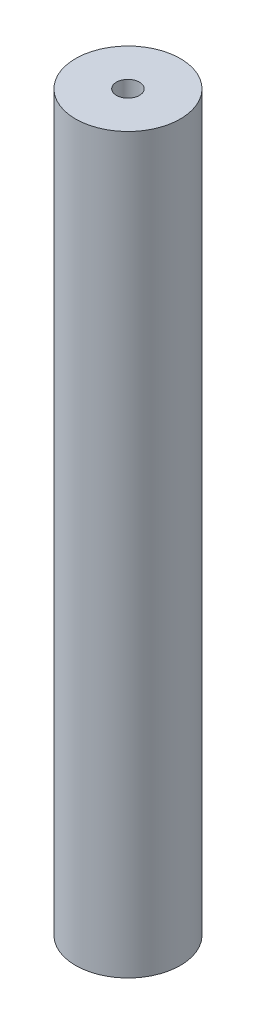
ISO-10303-21;
HEADER;
FILE_DESCRIPTION(('STEP AP214'),'2;1');
FILE_NAME('part.step','',(''),(''),'','','');
FILE_SCHEMA(('AUTOMOTIVE_DESIGN { 1 0 10303 214 1 1 1 1 }'));
ENDSEC;
DATA;
#1=APPLICATION_CONTEXT('core data for automotive mechanical design processes');
#2=APPLICATION_PROTOCOL_DEFINITION('international standard','automotive_design',2000,#1);
#3=PRODUCT_CONTEXT('',#1,'mechanical');
#4=PRODUCT('Part','Part','',(#3));
#5=PRODUCT_RELATED_PRODUCT_CATEGORY('part','',(#4));
#6=PRODUCT_DEFINITION_FORMATION('','',#4);
#7=PRODUCT_DEFINITION_CONTEXT('part definition',#1,'design');
#8=PRODUCT_DEFINITION('design','',#6,#7);
#9=PRODUCT_DEFINITION_SHAPE('','',#8);
#10=(LENGTH_UNIT() NAMED_UNIT(*) SI_UNIT(.MILLI.,.METRE.));
#11=(NAMED_UNIT(*) PLANE_ANGLE_UNIT() SI_UNIT($,.RADIAN.));
#12=(NAMED_UNIT(*) SI_UNIT($,.STERADIAN.) SOLID_ANGLE_UNIT());
#13=UNCERTAINTY_MEASURE_WITH_UNIT(LENGTH_MEASURE(1.E-05),#10,'distance_accuracy_value','');
#14=(GEOMETRIC_REPRESENTATION_CONTEXT(3) GLOBAL_UNCERTAINTY_ASSIGNED_CONTEXT((#13)) GLOBAL_UNIT_ASSIGNED_CONTEXT((#10,
#11,#12)) REPRESENTATION_CONTEXT('',''));
#15=CARTESIAN_POINT('',(0.,0.,0.));
#16=DIRECTION('',(0.,0.,1.));
#17=DIRECTION('',(1.,0.,0.));
#18=AXIS2_PLACEMENT_3D('',#15,#16,#17);
#19=CARTESIAN_POINT('',(0.,105.,0.));
#20=DIRECTION('',(0.,-1.,0.));
#21=DIRECTION('',(0.,0.,-1.));
#22=AXIS2_PLACEMENT_3D('',#19,#20,#21);
#23=CYLINDRICAL_SURFACE('',#22,7.49999999999999);
#24=CARTESIAN_POINT('',(0.,105.,0.));
#25=DIRECTION('',(0.,1.,0.));
#26=DIRECTION('',(0.,0.,1.));
#27=AXIS2_PLACEMENT_3D('',#24,#25,#26);
#28=CIRCLE('',#27,7.49999999999999);
#29=CARTESIAN_POINT('',(0.,105.,7.49999999999999));
#30=VERTEX_POINT('',#29);
#31=EDGE_CURVE('E11',#30,#30,#28,.T.);
#32=ORIENTED_EDGE('',*,*,#31,.F.);
#33=EDGE_LOOP('',(#32));
#34=FACE_BOUND('',#33,.T.);
#35=CARTESIAN_POINT('',(0.,0.,0.));
#36=DIRECTION('',(0.,1.,0.));
#37=DIRECTION('',(0.,0.,1.));
#38=AXIS2_PLACEMENT_3D('',#35,#36,#37);
#39=CIRCLE('',#38,7.49999999999999);
#40=CARTESIAN_POINT('',(0.,0.,7.49999999999999));
#41=VERTEX_POINT('',#40);
#42=EDGE_CURVE('E36',#41,#41,#39,.T.);
#43=ORIENTED_EDGE('',*,*,#42,.T.);
#44=EDGE_LOOP('',(#43));
#45=FACE_BOUND('',#44,.T.);
#46=ADVANCED_FACE('F33',(#34,#45),#23,.T.);
#47=CARTESIAN_POINT('',(0.,105.,0.));
#48=DIRECTION('',(0.,1.,0.));
#49=DIRECTION('',(0.,0.,1.));
#50=AXIS2_PLACEMENT_3D('',#47,#48,#49);
#51=PLANE('',#50);
#52=CARTESIAN_POINT('',(0.,105.,0.));
#53=DIRECTION('',(0.,1.,0.));
#54=DIRECTION('',(0.,0.,1.));
#55=AXIS2_PLACEMENT_3D('',#52,#53,#54);
#56=CIRCLE('',#55,1.64999999999999);
#57=CARTESIAN_POINT('',(0.,105.,1.64999999999999));
#58=VERTEX_POINT('',#57);
#59=EDGE_CURVE('E56',#58,#58,#56,.T.);
#60=ORIENTED_EDGE('',*,*,#59,.F.);
#61=EDGE_LOOP('',(#60));
#62=FACE_BOUND('',#61,.T.);
#63=ORIENTED_EDGE('',*,*,#31,.T.);
#64=EDGE_LOOP('',(#63));
#65=FACE_BOUND('',#64,.T.);
#66=ADVANCED_FACE('F75',(#62,#65),#51,.T.);
#67=CARTESIAN_POINT('',(0.,0.,0.));
#68=DIRECTION('',(0.,1.,0.));
#69=DIRECTION('',(0.,0.,1.));
#70=AXIS2_PLACEMENT_3D('',#67,#68,#69);
#71=PLANE('',#70);
#72=CARTESIAN_POINT('',(0.,0.,0.));
#73=DIRECTION('',(0.,-1.,0.));
#74=DIRECTION('',(0.,0.,-1.));
#75=AXIS2_PLACEMENT_3D('',#72,#73,#74);
#76=CIRCLE('',#75,1.64999999999999);
#77=CARTESIAN_POINT('',(0.,0.,-1.64999999999999));
#78=VERTEX_POINT('',#77);
#79=EDGE_CURVE('E57',#78,#78,#76,.T.);
#80=ORIENTED_EDGE('',*,*,#79,.F.);
#81=EDGE_LOOP('',(#80));
#82=FACE_BOUND('',#81,.T.);
#83=ORIENTED_EDGE('',*,*,#42,.F.);
#84=EDGE_LOOP('',(#83));
#85=FACE_BOUND('',#84,.T.);
#86=ADVANCED_FACE('F72',(#82,#85),#71,.F.);
#87=CARTESIAN_POINT('',(0.,85.,0.));
#88=DIRECTION('',(0.,1.,0.));
#89=DIRECTION('',(0.,0.,1.));
#90=AXIS2_PLACEMENT_3D('',#87,#88,#89);
#91=CONICAL_SURFACE('',#90,1.65,1.02974425867665);
#92=CARTESIAN_POINT('',(0.,84.0085799786045,0.));
#93=VERTEX_POINT('',#92);
#94=VERTEX_LOOP('',#93);
#95=FACE_BOUND('',#94,.T.);
#96=CARTESIAN_POINT('',(0.,85.,0.));
#97=DIRECTION('',(0.,1.,0.));
#98=DIRECTION('',(0.,0.,1.));
#99=AXIS2_PLACEMENT_3D('',#96,#97,#98);
#100=CIRCLE('',#99,1.65);
#101=CARTESIAN_POINT('',(0.,85.,1.65));
#102=VERTEX_POINT('',#101);
#103=EDGE_CURVE('E60',#102,#102,#100,.T.);
#104=ORIENTED_EDGE('',*,*,#103,.T.);
#105=EDGE_LOOP('',(#104));
#106=FACE_BOUND('',#105,.T.);
#107=ADVANCED_FACE('F74',(#95,#106),#91,.F.);
#108=CARTESIAN_POINT('',(0.,105.,0.));
#109=DIRECTION('',(0.,1.,0.));
#110=DIRECTION('',(0.,0.,1.));
#111=AXIS2_PLACEMENT_3D('',#108,#109,#110);
#112=CYLINDRICAL_SURFACE('',#111,1.64999999999999);
#113=ORIENTED_EDGE('',*,*,#103,.F.);
#114=EDGE_LOOP('',(#113));
#115=FACE_BOUND('',#114,.T.);
#116=ORIENTED_EDGE('',*,*,#59,.T.);
#117=EDGE_LOOP('',(#116));
#118=FACE_BOUND('',#117,.T.);
#119=ADVANCED_FACE('F50',(#115,#118),#112,.F.);
#120=CARTESIAN_POINT('',(0.,20.,0.));
#121=DIRECTION('',(0.,-1.,0.));
#122=DIRECTION('',(0.,0.,-1.));
#123=AXIS2_PLACEMENT_3D('',#120,#121,#122);
#124=CONICAL_SURFACE('',#123,1.65,1.02974425867665);
#125=CARTESIAN_POINT('',(0.,20.9914200213955,0.));
#126=VERTEX_POINT('',#125);
#127=VERTEX_LOOP('',#126);
#128=FACE_BOUND('',#127,.T.);
#129=CARTESIAN_POINT('',(0.,20.,0.));
#130=DIRECTION('',(0.,-1.,0.));
#131=DIRECTION('',(0.,0.,-1.));
#132=AXIS2_PLACEMENT_3D('',#129,#130,#131);
#133=CIRCLE('',#132,1.65);
#134=CARTESIAN_POINT('',(0.,20.,-1.65));
#135=VERTEX_POINT('',#134);
#136=EDGE_CURVE('E54',#135,#135,#133,.T.);
#137=ORIENTED_EDGE('',*,*,#136,.T.);
#138=EDGE_LOOP('',(#137));
#139=FACE_BOUND('',#138,.T.);
#140=ADVANCED_FACE('F46',(#128,#139),#124,.F.);
#141=CARTESIAN_POINT('',(0.,0.,0.));
#142=DIRECTION('',(0.,-1.,0.));
#143=DIRECTION('',(0.,0.,-1.));
#144=AXIS2_PLACEMENT_3D('',#141,#142,#143);
#145=CYLINDRICAL_SURFACE('',#144,1.64999999999999);
#146=ORIENTED_EDGE('',*,*,#136,.F.);
#147=EDGE_LOOP('',(#146));
#148=FACE_BOUND('',#147,.T.);
#149=ORIENTED_EDGE('',*,*,#79,.T.);
#150=EDGE_LOOP('',(#149));
#151=FACE_BOUND('',#150,.T.);
#152=ADVANCED_FACE('F49',(#148,#151),#145,.F.);
#153=CLOSED_SHELL('',(#46,#66,#86,#107,#119,#140,#152));
#154=MANIFOLD_SOLID_BREP('B2',#153);
#155=ADVANCED_BREP_SHAPE_REPRESENTATION('',(#18,#154),#14);
#156=SHAPE_DEFINITION_REPRESENTATION(#9,#155);
ENDSEC;
END-ISO-10303-21;
